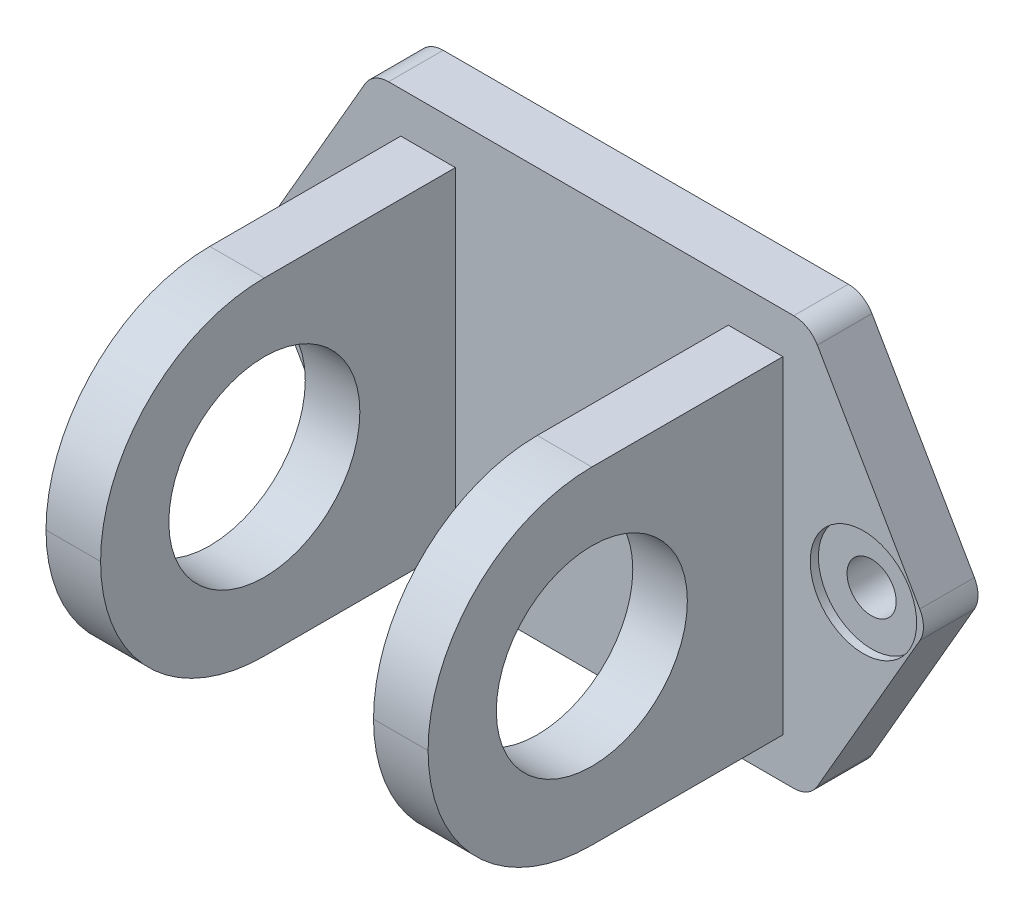
ISO-10303-21;
HEADER;
FILE_DESCRIPTION(('STEP AP214'),'2;1');
FILE_NAME('part.step','',(''),(''),'','','');
FILE_SCHEMA(('AUTOMOTIVE_DESIGN { 1 0 10303 214 1 1 1 1 }'));
ENDSEC;
DATA;
#1=APPLICATION_CONTEXT('core data for automotive mechanical design processes');
#2=APPLICATION_PROTOCOL_DEFINITION('international standard','automotive_design',2000,#1);
#3=PRODUCT_CONTEXT('',#1,'mechanical');
#4=PRODUCT('Part','Part','',(#3));
#5=PRODUCT_RELATED_PRODUCT_CATEGORY('part','',(#4));
#6=PRODUCT_DEFINITION_FORMATION('','',#4);
#7=PRODUCT_DEFINITION_CONTEXT('part definition',#1,'design');
#8=PRODUCT_DEFINITION('design','',#6,#7);
#9=PRODUCT_DEFINITION_SHAPE('','',#8);
#10=(LENGTH_UNIT() NAMED_UNIT(*) SI_UNIT(.MILLI.,.METRE.));
#11=(NAMED_UNIT(*) PLANE_ANGLE_UNIT() SI_UNIT($,.RADIAN.));
#12=(NAMED_UNIT(*) SI_UNIT($,.STERADIAN.) SOLID_ANGLE_UNIT());
#13=UNCERTAINTY_MEASURE_WITH_UNIT(LENGTH_MEASURE(1.E-05),#10,'distance_accuracy_value','');
#14=(GEOMETRIC_REPRESENTATION_CONTEXT(3) GLOBAL_UNCERTAINTY_ASSIGNED_CONTEXT((#13)) GLOBAL_UNIT_ASSIGNED_CONTEXT((#10,
#11,#12)) REPRESENTATION_CONTEXT('',''));
#15=CARTESIAN_POINT('',(0.,0.,0.));
#16=DIRECTION('',(0.,0.,1.));
#17=DIRECTION('',(1.,0.,0.));
#18=AXIS2_PLACEMENT_3D('',#15,#16,#17);
#19=CARTESIAN_POINT('',(-75.0456683677447,-9.16171908362269,0.));
#20=DIRECTION('',(0.,0.,1.));
#21=DIRECTION('',(1.,0.,0.));
#22=AXIS2_PLACEMENT_3D('',#19,#20,#21);
#23=CYLINDRICAL_SURFACE('',#22,9.);
#24=CARTESIAN_POINT('',(-75.0456683677447,-9.16171908362269,0.));
#25=DIRECTION('',(0.,0.,1.));
#26=DIRECTION('',(1.,0.,0.));
#27=AXIS2_PLACEMENT_3D('',#24,#25,#26);
#28=CIRCLE('',#27,9.);
#29=CARTESIAN_POINT('',(-66.0456683677447,-9.16171908362269,0.));
#30=VERTEX_POINT('',#29);
#31=EDGE_CURVE('E362',#30,#30,#28,.T.);
#32=ORIENTED_EDGE('',*,*,#31,.F.);
#33=EDGE_LOOP('',(#32));
#34=FACE_BOUND('',#33,.T.);
#35=CARTESIAN_POINT('',(-75.0456683677447,-9.16171908362269,17.));
#36=DIRECTION('',(0.,0.,1.));
#37=DIRECTION('',(1.,0.,0.));
#38=AXIS2_PLACEMENT_3D('',#35,#36,#37);
#39=CIRCLE('',#38,9.);
#40=CARTESIAN_POINT('',(-66.0456683677447,-9.16171908362269,17.));
#41=VERTEX_POINT('',#40);
#42=EDGE_CURVE('E42',#41,#41,#39,.F.);
#43=ORIENTED_EDGE('',*,*,#42,.F.);
#44=EDGE_LOOP('',(#43));
#45=FACE_BOUND('',#44,.T.);
#46=ADVANCED_FACE('F38',(#34,#45),#23,.F.);
#47=CARTESIAN_POINT('',(-274.554197978604,-9.16171905813241,0.));
#48=DIRECTION('',(0.,0.,1.));
#49=DIRECTION('',(1.,0.,0.));
#50=AXIS2_PLACEMENT_3D('',#47,#48,#49);
#51=CYLINDRICAL_SURFACE('',#50,8.99999999999998);
#52=CARTESIAN_POINT('',(-274.554197978604,-9.16171905813241,0.));
#53=DIRECTION('',(0.,0.,1.));
#54=DIRECTION('',(1.,0.,0.));
#55=AXIS2_PLACEMENT_3D('',#52,#53,#54);
#56=CIRCLE('',#55,8.99999999999998);
#57=CARTESIAN_POINT('',(-265.554197978604,-9.16171905813241,0.));
#58=VERTEX_POINT('',#57);
#59=EDGE_CURVE('E377',#58,#58,#56,.T.);
#60=ORIENTED_EDGE('',*,*,#59,.F.);
#61=EDGE_LOOP('',(#60));
#62=FACE_BOUND('',#61,.T.);
#63=CARTESIAN_POINT('',(-274.554197978604,-9.16171905813241,17.));
#64=DIRECTION('',(0.,0.,1.));
#65=DIRECTION('',(1.,0.,0.));
#66=AXIS2_PLACEMENT_3D('',#63,#64,#65);
#67=CIRCLE('',#66,8.99999999999998);
#68=CARTESIAN_POINT('',(-265.554197978604,-9.16171905813241,17.));
#69=VERTEX_POINT('',#68);
#70=EDGE_CURVE('E356',#69,#69,#67,.F.);
#71=ORIENTED_EDGE('',*,*,#70,.F.);
#72=EDGE_LOOP('',(#71));
#73=FACE_BOUND('',#72,.T.);
#74=ADVANCED_FACE('F417',(#62,#73),#51,.F.);
#75=CARTESIAN_POINT('',(0.,0.,20.));
#76=DIRECTION('',(0.,0.,-1.));
#77=DIRECTION('',(-1.,0.,0.));
#78=AXIS2_PLACEMENT_3D('',#75,#76,#77);
#79=PLANE('',#78);
#80=CARTESIAN_POINT('',(-274.554197978604,-9.16171905813241,20.));
#81=DIRECTION('',(0.,0.,1.));
#82=DIRECTION('',(1.,0.,0.));
#83=AXIS2_PLACEMENT_3D('',#80,#81,#82);
#84=CIRCLE('',#83,19.3755110080059);
#85=CARTESIAN_POINT('',(-255.178686970598,-9.16171905813241,20.));
#86=VERTEX_POINT('',#85);
#87=EDGE_CURVE('E364',#86,#86,#84,.T.);
#88=ORIENTED_EDGE('',*,*,#87,.F.);
#89=EDGE_LOOP('',(#88));
#90=FACE_BOUND('',#89,.T.);
#91=CARTESIAN_POINT('',(-75.0456683677447,-9.16171908362269,20.));
#92=DIRECTION('',(0.,0.,1.));
#93=DIRECTION('',(1.,0.,0.));
#94=AXIS2_PLACEMENT_3D('',#91,#92,#93);
#95=CIRCLE('',#94,19.5008846682352);
#96=CARTESIAN_POINT('',(-55.5447836995095,-9.16171908362269,20.));
#97=VERTEX_POINT('',#96);
#98=EDGE_CURVE('E374',#97,#97,#95,.T.);
#99=ORIENTED_EDGE('',*,*,#98,.F.);
#100=EDGE_LOOP('',(#99));
#101=FACE_BOUND('',#100,.T.);
#102=DIRECTION('',(0.,-1.,0.));
#103=VECTOR('',#102,1.);
#104=CARTESIAN_POINT('',(-244.554197978604,50.8382809418676,20.));
#105=LINE('',#104,#103);
#106=CARTESIAN_POINT('',(-244.554197978604,50.8382809418676,20.));
#107=VERTEX_POINT('',#106);
#108=CARTESIAN_POINT('',(-244.554197978604,-69.1617190581324,20.));
#109=VERTEX_POINT('',#108);
#110=EDGE_CURVE('E222',#107,#109,#105,.T.);
#111=ORIENTED_EDGE('',*,*,#110,.F.);
#112=DIRECTION('',(-1.,0.,0.));
#113=VECTOR('',#112,1.);
#114=CARTESIAN_POINT('',(-244.554197978604,50.8382809418676,20.));
#115=LINE('',#114,#113);
#116=CARTESIAN_POINT('',(-224.554197978604,50.8382809418676,20.));
#117=VERTEX_POINT('',#116);
#118=EDGE_CURVE('E231',#117,#107,#115,.T.);
#119=ORIENTED_EDGE('',*,*,#118,.F.);
#120=DIRECTION('',(0.,1.,0.));
#121=VECTOR('',#120,1.);
#122=CARTESIAN_POINT('',(-224.554197978604,50.8382809418676,20.));
#123=LINE('',#122,#121);
#124=CARTESIAN_POINT('',(-224.554197978604,-69.1617190581324,20.));
#125=VERTEX_POINT('',#124);
#126=EDGE_CURVE('E228',#125,#117,#123,.T.);
#127=ORIENTED_EDGE('',*,*,#126,.F.);
#128=DIRECTION('',(1.,0.,0.));
#129=VECTOR('',#128,1.);
#130=CARTESIAN_POINT('',(-244.554197978604,-69.1617190581324,20.));
#131=LINE('',#130,#129);
#132=EDGE_CURVE('E225',#109,#125,#131,.T.);
#133=ORIENTED_EDGE('',*,*,#132,.F.);
#134=EDGE_LOOP('',(#111,#119,#127,#133));
#135=FACE_BOUND('',#134,.T.);
#136=DIRECTION('',(0.499999989191975,0.866025410024455,0.));
#137=VECTOR('',#136,1.);
#138=CARTESIAN_POINT('',(-51.4986629839522,-9.16171905813241,20.));
#139=LINE('',#138,#137);
#140=CARTESIAN_POINT('',(-91.9131806000229,-79.1617189500522,20.));
#141=VERTEX_POINT('',#140);
#142=CARTESIAN_POINT('',(-54.3854142675002,-14.1617190941592,20.));
#143=VERTEX_POINT('',#142);
#144=EDGE_CURVE('E256',#141,#143,#139,.T.);
#145=ORIENTED_EDGE('',*,*,#144,.T.);
#146=CARTESIAN_POINT('',(-63.0456683677447,-9.16171920223945,20.));
#147=DIRECTION('',(0.,0.,-1.));
#148=DIRECTION('',(-1.,0.,0.));
#149=AXIS2_PLACEMENT_3D('',#146,#147,#148);
#150=CIRCLE('',#149,10.);
#151=CARTESIAN_POINT('',(-54.3854143923005,-4.16171909415917,20.));
#152=VERTEX_POINT('',#151);
#153=EDGE_CURVE('E330',#143,#152,#150,.F.);
#154=ORIENTED_EDGE('',*,*,#153,.T.);
#155=DIRECTION('',(-0.500000010808027,0.866025397544421,0.));
#156=VECTOR('',#155,1.);
#157=CARTESIAN_POINT('',(-94.7999344211776,65.8382809418676,20.));
#158=LINE('',#157,#156);
#159=CARTESIAN_POINT('',(-91.9131830544294,60.8382810499479,20.));
#160=VERTEX_POINT('',#159);
#161=EDGE_CURVE('E259',#152,#160,#158,.T.);
#162=ORIENTED_EDGE('',*,*,#161,.T.);
#163=CARTESIAN_POINT('',(-100.573437029874,55.8382809418676,20.));
#164=DIRECTION('',(0.,0.,-1.));
#165=DIRECTION('',(-1.,0.,0.));
#166=AXIS2_PLACEMENT_3D('',#163,#164,#165);
#167=CIRCLE('',#166,10.);
#168=CARTESIAN_POINT('',(-100.573437029874,65.8382809418676,20.));
#169=VERTEX_POINT('',#168);
#170=EDGE_CURVE('E285',#160,#169,#167,.F.);
#171=ORIENTED_EDGE('',*,*,#170,.T.);
#172=DIRECTION('',(-1.,0.,0.));
#173=VECTOR('',#172,1.);
#174=CARTESIAN_POINT('',(-254.799934421178,65.8382809418676,20.));
#175=LINE('',#174,#173);
#176=CARTESIAN_POINT('',(-249.026431646081,65.8382809418676,20.));
#177=VERTEX_POINT('',#176);
#178=EDGE_CURVE('E243',#169,#177,#175,.T.);
#179=ORIENTED_EDGE('',*,*,#178,.T.);
#180=CARTESIAN_POINT('',(-249.026431646081,55.8382809418676,20.));
#181=DIRECTION('',(0.,0.,-1.));
#182=DIRECTION('',(-1.,0.,0.));
#183=AXIS2_PLACEMENT_3D('',#180,#181,#182);
#184=CIRCLE('',#183,10.);
#185=CARTESIAN_POINT('',(-257.686685746326,60.8382808337873,20.));
#186=VERTEX_POINT('',#185);
#187=EDGE_CURVE('E294',#177,#186,#184,.F.);
#188=ORIENTED_EDGE('',*,*,#187,.T.);
#189=DIRECTION('',(-0.499999989191975,-0.866025410024455,0.));
#190=VECTOR('',#189,1.);
#191=CARTESIAN_POINT('',(-254.799934421178,65.8382809418676,20.));
#192=LINE('',#191,#190);
#193=CARTESIAN_POINT('',(-295.214452078848,-4.16171902210563,20.));
#194=VERTEX_POINT('',#193);
#195=EDGE_CURVE('E246',#186,#194,#192,.T.);
#196=ORIENTED_EDGE('',*,*,#195,.T.);
#197=CARTESIAN_POINT('',(-286.554197978604,-9.16171891402537,20.));
#198=DIRECTION('',(0.,0.,-1.));
#199=DIRECTION('',(-1.,0.,0.));
#200=AXIS2_PLACEMENT_3D('',#197,#198,#199);
#201=CIRCLE('',#200,10.);
#202=CARTESIAN_POINT('',(-295.214451954048,-14.1617190221057,20.));
#203=VERTEX_POINT('',#202);
#204=EDGE_CURVE('E303',#194,#203,#201,.F.);
#205=ORIENTED_EDGE('',*,*,#204,.T.);
#206=DIRECTION('',(0.500000010808027,-0.866025397544421,0.));
#207=VECTOR('',#206,1.);
#208=CARTESIAN_POINT('',(-298.101203362396,-9.16171905813241,20.));
#209=LINE('',#208,#207);
#210=CARTESIAN_POINT('',(-257.686683291919,-79.1617191662127,20.));
#211=VERTEX_POINT('',#210);
#212=EDGE_CURVE('E250',#203,#211,#209,.T.);
#213=ORIENTED_EDGE('',*,*,#212,.T.);
#214=CARTESIAN_POINT('',(-249.026429316475,-74.1617190581324,20.));
#215=DIRECTION('',(0.,0.,-1.));
#216=DIRECTION('',(-1.,0.,0.));
#217=AXIS2_PLACEMENT_3D('',#214,#215,#216);
#218=CIRCLE('',#217,10.);
#219=CARTESIAN_POINT('',(-249.026429316475,-84.1617190581324,20.));
#220=VERTEX_POINT('',#219);
#221=EDGE_CURVE('E312',#211,#220,#218,.F.);
#222=ORIENTED_EDGE('',*,*,#221,.T.);
#223=DIRECTION('',(1.,0.,0.));
#224=VECTOR('',#223,1.);
#225=CARTESIAN_POINT('',(-254.799931925171,-84.1617190581324,20.));
#226=LINE('',#225,#224);
#227=CARTESIAN_POINT('',(-100.573434700267,-84.1617190581324,20.));
#228=VERTEX_POINT('',#227);
#229=EDGE_CURVE('E253',#220,#228,#226,.T.);
#230=ORIENTED_EDGE('',*,*,#229,.T.);
#231=CARTESIAN_POINT('',(-100.573434700267,-74.1617190581324,20.));
#232=DIRECTION('',(0.,0.,-1.));
#233=DIRECTION('',(-1.,0.,0.));
#234=AXIS2_PLACEMENT_3D('',#231,#232,#233);
#235=CIRCLE('',#234,10.);
#236=EDGE_CURVE('E321',#228,#141,#235,.F.);
#237=ORIENTED_EDGE('',*,*,#236,.T.);
#238=EDGE_LOOP('',(#145,#154,#162,#171,#179,#188,#196,#205,#213,#222,#230,#237));
#239=FACE_BOUND('',#238,.T.);
#240=DIRECTION('',(0.,-1.,0.));
#241=VECTOR('',#240,1.);
#242=CARTESIAN_POINT('',(-124.554197978604,50.8382809418676,20.));
#243=LINE('',#242,#241);
#244=CARTESIAN_POINT('',(-124.554197978604,50.8382809418676,20.));
#245=VERTEX_POINT('',#244);
#246=CARTESIAN_POINT('',(-124.554197978604,-69.1617190581324,20.));
#247=VERTEX_POINT('',#246);
#248=EDGE_CURVE('E192',#245,#247,#243,.T.);
#249=ORIENTED_EDGE('',*,*,#248,.F.);
#250=DIRECTION('',(-1.,0.,0.));
#251=VECTOR('',#250,1.);
#252=CARTESIAN_POINT('',(-124.554197978604,50.8382809418676,20.));
#253=LINE('',#252,#251);
#254=CARTESIAN_POINT('',(-104.554197978604,50.8382809418676,20.));
#255=VERTEX_POINT('',#254);
#256=EDGE_CURVE('E198',#255,#245,#253,.T.);
#257=ORIENTED_EDGE('',*,*,#256,.F.);
#258=DIRECTION('',(0.,1.,0.));
#259=VECTOR('',#258,1.);
#260=CARTESIAN_POINT('',(-104.554197978604,50.8382809418676,20.));
#261=LINE('',#260,#259);
#262=CARTESIAN_POINT('',(-104.554197978604,-69.1617190581324,20.));
#263=VERTEX_POINT('',#262);
#264=EDGE_CURVE('E212',#263,#255,#261,.T.);
#265=ORIENTED_EDGE('',*,*,#264,.F.);
#266=DIRECTION('',(1.,0.,0.));
#267=VECTOR('',#266,1.);
#268=CARTESIAN_POINT('',(-124.554197978604,-69.1617190581324,20.));
#269=LINE('',#268,#267);
#270=EDGE_CURVE('E207',#247,#263,#269,.T.);
#271=ORIENTED_EDGE('',*,*,#270,.F.);
#272=EDGE_LOOP('',(#249,#257,#265,#271));
#273=FACE_BOUND('',#272,.T.);
#274=ADVANCED_FACE('F203',(#90,#101,#135,#239,#273),#79,.F.);
#275=CARTESIAN_POINT('',(-254.799934421178,65.8382809418676,20.));
#276=DIRECTION('',(0.,-1.,0.));
#277=DIRECTION('',(0.,0.,-1.));
#278=AXIS2_PLACEMENT_3D('',#275,#276,#277);
#279=PLANE('',#278);
#280=DIRECTION('',(-1.,0.,0.));
#281=VECTOR('',#280,1.);
#282=CARTESIAN_POINT('',(-254.799934421178,65.8382809418676,0.));
#283=LINE('',#282,#281);
#284=CARTESIAN_POINT('',(-100.573437029874,65.8382809418676,0.));
#285=VERTEX_POINT('',#284);
#286=CARTESIAN_POINT('',(-249.026431646081,65.8382809418676,0.));
#287=VERTEX_POINT('',#286);
#288=EDGE_CURVE('E242',#285,#287,#283,.T.);
#289=ORIENTED_EDGE('',*,*,#288,.T.);
#290=DIRECTION('',(0.,0.,-1.));
#291=VECTOR('',#290,1.);
#292=CARTESIAN_POINT('',(-249.026431646081,65.8382809418676,20.));
#293=LINE('',#292,#291);
#294=EDGE_CURVE('E292',#287,#177,#293,.F.);
#295=ORIENTED_EDGE('',*,*,#294,.T.);
#296=ORIENTED_EDGE('',*,*,#178,.F.);
#297=DIRECTION('',(0.,0.,-1.));
#298=VECTOR('',#297,1.);
#299=CARTESIAN_POINT('',(-100.573437029874,65.8382809418676,20.));
#300=LINE('',#299,#298);
#301=EDGE_CURVE('E261',#169,#285,#300,.T.);
#302=ORIENTED_EDGE('',*,*,#301,.T.);
#303=EDGE_LOOP('',(#289,#295,#296,#302));
#304=FACE_BOUND('',#303,.T.);
#305=ADVANCED_FACE('F481',(#304),#279,.F.);
#306=CARTESIAN_POINT('',(-254.799934421178,65.8382809418676,20.));
#307=DIRECTION('',(0.866025410024455,-0.499999989191975,0.));
#308=DIRECTION('',(0.499999989191975,0.866025410024455,0.));
#309=AXIS2_PLACEMENT_3D('',#306,#307,#308);
#310=PLANE('',#309);
#311=DIRECTION('',(-0.499999989191975,-0.866025410024455,0.));
#312=VECTOR('',#311,1.);
#313=CARTESIAN_POINT('',(-254.799934421178,65.8382809418676,0.));
#314=LINE('',#313,#312);
#315=CARTESIAN_POINT('',(-257.686685746326,60.8382808337873,0.));
#316=VERTEX_POINT('',#315);
#317=CARTESIAN_POINT('',(-295.214452078848,-4.16171902210563,0.));
#318=VERTEX_POINT('',#317);
#319=EDGE_CURVE('E264',#316,#318,#314,.T.);
#320=ORIENTED_EDGE('',*,*,#319,.T.);
#321=DIRECTION('',(0.,0.,-1.));
#322=VECTOR('',#321,1.);
#323=CARTESIAN_POINT('',(-295.214452078848,-4.16171902210563,20.));
#324=LINE('',#323,#322);
#325=EDGE_CURVE('E301',#318,#194,#324,.F.);
#326=ORIENTED_EDGE('',*,*,#325,.T.);
#327=ORIENTED_EDGE('',*,*,#195,.F.);
#328=DIRECTION('',(0.,0.,-1.));
#329=VECTOR('',#328,1.);
#330=CARTESIAN_POINT('',(-257.686685746326,60.8382808337873,20.));
#331=LINE('',#330,#329);
#332=EDGE_CURVE('E287',#186,#316,#331,.T.);
#333=ORIENTED_EDGE('',*,*,#332,.T.);
#334=EDGE_LOOP('',(#320,#326,#327,#333));
#335=FACE_BOUND('',#334,.T.);
#336=ADVANCED_FACE('F503',(#335),#310,.F.);
#337=CARTESIAN_POINT('',(-298.101203362396,-9.16171905813241,20.));
#338=DIRECTION('',(0.866025397544421,0.500000010808027,0.));
#339=DIRECTION('',(-0.500000010808027,0.866025397544421,0.));
#340=AXIS2_PLACEMENT_3D('',#337,#338,#339);
#341=PLANE('',#340);
#342=DIRECTION('',(0.500000010808027,-0.866025397544421,0.));
#343=VECTOR('',#342,1.);
#344=CARTESIAN_POINT('',(-298.101203362396,-9.16171905813241,0.));
#345=LINE('',#344,#343);
#346=CARTESIAN_POINT('',(-295.214451954048,-14.1617190221057,0.));
#347=VERTEX_POINT('',#346);
#348=CARTESIAN_POINT('',(-257.686683291919,-79.1617191662127,0.));
#349=VERTEX_POINT('',#348);
#350=EDGE_CURVE('E267',#347,#349,#345,.T.);
#351=ORIENTED_EDGE('',*,*,#350,.T.);
#352=DIRECTION('',(0.,0.,-1.));
#353=VECTOR('',#352,1.);
#354=CARTESIAN_POINT('',(-257.686683291919,-79.1617191662127,20.));
#355=LINE('',#354,#353);
#356=EDGE_CURVE('E310',#349,#211,#355,.F.);
#357=ORIENTED_EDGE('',*,*,#356,.T.);
#358=ORIENTED_EDGE('',*,*,#212,.F.);
#359=DIRECTION('',(0.,0.,-1.));
#360=VECTOR('',#359,1.);
#361=CARTESIAN_POINT('',(-295.214451954048,-14.1617190221057,20.));
#362=LINE('',#361,#360);
#363=EDGE_CURVE('E296',#203,#347,#362,.T.);
#364=ORIENTED_EDGE('',*,*,#363,.T.);
#365=EDGE_LOOP('',(#351,#357,#358,#364));
#366=FACE_BOUND('',#365,.T.);
#367=ADVANCED_FACE('F499',(#366),#341,.F.);
#368=CARTESIAN_POINT('',(-254.799931925171,-84.1617190581324,20.));
#369=DIRECTION('',(0.,1.,0.));
#370=DIRECTION('',(0.,0.,1.));
#371=AXIS2_PLACEMENT_3D('',#368,#369,#370);
#372=PLANE('',#371);
#373=DIRECTION('',(1.,0.,0.));
#374=VECTOR('',#373,1.);
#375=CARTESIAN_POINT('',(-254.799931925171,-84.1617190581324,0.));
#376=LINE('',#375,#374);
#377=CARTESIAN_POINT('',(-249.026429316475,-84.1617190581324,0.));
#378=VERTEX_POINT('',#377);
#379=CARTESIAN_POINT('',(-100.573434700267,-84.1617190581324,0.));
#380=VERTEX_POINT('',#379);
#381=EDGE_CURVE('E270',#378,#380,#376,.T.);
#382=ORIENTED_EDGE('',*,*,#381,.T.);
#383=DIRECTION('',(0.,0.,-1.));
#384=VECTOR('',#383,1.);
#385=CARTESIAN_POINT('',(-100.573434700267,-84.1617190581324,20.));
#386=LINE('',#385,#384);
#387=EDGE_CURVE('E319',#380,#228,#386,.F.);
#388=ORIENTED_EDGE('',*,*,#387,.T.);
#389=ORIENTED_EDGE('',*,*,#229,.F.);
#390=DIRECTION('',(0.,0.,-1.));
#391=VECTOR('',#390,1.);
#392=CARTESIAN_POINT('',(-249.026429316475,-84.1617190581324,20.));
#393=LINE('',#392,#391);
#394=EDGE_CURVE('E305',#220,#378,#393,.T.);
#395=ORIENTED_EDGE('',*,*,#394,.T.);
#396=EDGE_LOOP('',(#382,#388,#389,#395));
#397=FACE_BOUND('',#396,.T.);
#398=ADVANCED_FACE('F495',(#397),#372,.F.);
#399=CARTESIAN_POINT('',(-51.4986629839522,-9.16171905813241,20.));
#400=DIRECTION('',(-0.866025410024455,0.499999989191975,0.));
#401=DIRECTION('',(-0.499999989191975,-0.866025410024455,0.));
#402=AXIS2_PLACEMENT_3D('',#399,#400,#401);
#403=PLANE('',#402);
#404=DIRECTION('',(0.499999989191975,0.866025410024455,0.));
#405=VECTOR('',#404,1.);
#406=CARTESIAN_POINT('',(-51.4986629839522,-9.16171905813241,0.));
#407=LINE('',#406,#405);
#408=CARTESIAN_POINT('',(-91.9131806000229,-79.1617189500522,0.));
#409=VERTEX_POINT('',#408);
#410=CARTESIAN_POINT('',(-54.3854142675002,-14.1617190941592,0.));
#411=VERTEX_POINT('',#410);
#412=EDGE_CURVE('E273',#409,#411,#407,.T.);
#413=ORIENTED_EDGE('',*,*,#412,.T.);
#414=DIRECTION('',(0.,0.,-1.));
#415=VECTOR('',#414,1.);
#416=CARTESIAN_POINT('',(-54.3854142675002,-14.1617190941592,20.));
#417=LINE('',#416,#415);
#418=EDGE_CURVE('E328',#411,#143,#417,.F.);
#419=ORIENTED_EDGE('',*,*,#418,.T.);
#420=ORIENTED_EDGE('',*,*,#144,.F.);
#421=DIRECTION('',(0.,0.,-1.));
#422=VECTOR('',#421,1.);
#423=CARTESIAN_POINT('',(-91.9131806000229,-79.1617189500522,20.));
#424=LINE('',#423,#422);
#425=EDGE_CURVE('E314',#141,#409,#424,.T.);
#426=ORIENTED_EDGE('',*,*,#425,.T.);
#427=EDGE_LOOP('',(#413,#419,#420,#426));
#428=FACE_BOUND('',#427,.T.);
#429=ADVANCED_FACE('F491',(#428),#403,.F.);
#430=CARTESIAN_POINT('',(-94.7999344211776,65.8382809418676,20.));
#431=DIRECTION('',(-0.866025397544421,-0.500000010808027,0.));
#432=DIRECTION('',(0.500000010808027,-0.866025397544421,0.));
#433=AXIS2_PLACEMENT_3D('',#430,#431,#432);
#434=PLANE('',#433);
#435=ORIENTED_EDGE('',*,*,#161,.F.);
#436=DIRECTION('',(0.,0.,-1.));
#437=VECTOR('',#436,1.);
#438=CARTESIAN_POINT('',(-54.3854143923005,-4.16171909415917,20.));
#439=LINE('',#438,#437);
#440=CARTESIAN_POINT('',(-54.3854143923005,-4.16171909415917,0.));
#441=VERTEX_POINT('',#440);
#442=EDGE_CURVE('E323',#152,#441,#439,.T.);
#443=ORIENTED_EDGE('',*,*,#442,.T.);
#444=DIRECTION('',(-0.500000010808027,0.866025397544421,0.));
#445=VECTOR('',#444,1.);
#446=CARTESIAN_POINT('',(-94.7999344211776,65.8382809418676,0.));
#447=LINE('',#446,#445);
#448=CARTESIAN_POINT('',(-91.9131830544294,60.8382810499479,0.));
#449=VERTEX_POINT('',#448);
#450=EDGE_CURVE('E247',#441,#449,#447,.T.);
#451=ORIENTED_EDGE('',*,*,#450,.T.);
#452=DIRECTION('',(0.,0.,-1.));
#453=VECTOR('',#452,1.);
#454=CARTESIAN_POINT('',(-91.9131830544294,60.8382810499479,20.));
#455=LINE('',#454,#453);
#456=EDGE_CURVE('E282',#449,#160,#455,.F.);
#457=ORIENTED_EDGE('',*,*,#456,.T.);
#458=EDGE_LOOP('',(#435,#443,#451,#457));
#459=FACE_BOUND('',#458,.T.);
#460=ADVANCED_FACE('F487',(#459),#434,.F.);
#461=CARTESIAN_POINT('',(0.,0.,0.));
#462=DIRECTION('',(0.,0.,-1.));
#463=DIRECTION('',(-1.,0.,0.));
#464=AXIS2_PLACEMENT_3D('',#461,#462,#463);
#465=PLANE('',#464);
#466=ORIENTED_EDGE('',*,*,#59,.T.);
#467=EDGE_LOOP('',(#466));
#468=FACE_BOUND('',#467,.T.);
#469=ORIENTED_EDGE('',*,*,#31,.T.);
#470=EDGE_LOOP('',(#469));
#471=FACE_BOUND('',#470,.T.);
#472=ORIENTED_EDGE('',*,*,#450,.F.);
#473=CARTESIAN_POINT('',(-63.0456683677447,-9.16171920223945,0.));
#474=DIRECTION('',(0.,0.,-1.));
#475=DIRECTION('',(-1.,0.,0.));
#476=AXIS2_PLACEMENT_3D('',#473,#474,#475);
#477=CIRCLE('',#476,10.);
#478=EDGE_CURVE('E326',#441,#411,#477,.T.);
#479=ORIENTED_EDGE('',*,*,#478,.T.);
#480=ORIENTED_EDGE('',*,*,#412,.F.);
#481=CARTESIAN_POINT('',(-100.573434700267,-74.1617190581324,0.));
#482=DIRECTION('',(0.,0.,-1.));
#483=DIRECTION('',(-1.,0.,0.));
#484=AXIS2_PLACEMENT_3D('',#481,#482,#483);
#485=CIRCLE('',#484,10.);
#486=EDGE_CURVE('E317',#409,#380,#485,.T.);
#487=ORIENTED_EDGE('',*,*,#486,.T.);
#488=ORIENTED_EDGE('',*,*,#381,.F.);
#489=CARTESIAN_POINT('',(-249.026429316475,-74.1617190581324,0.));
#490=DIRECTION('',(0.,0.,-1.));
#491=DIRECTION('',(-1.,0.,0.));
#492=AXIS2_PLACEMENT_3D('',#489,#490,#491);
#493=CIRCLE('',#492,10.);
#494=EDGE_CURVE('E308',#378,#349,#493,.T.);
#495=ORIENTED_EDGE('',*,*,#494,.T.);
#496=ORIENTED_EDGE('',*,*,#350,.F.);
#497=CARTESIAN_POINT('',(-286.554197978604,-9.16171891402537,0.));
#498=DIRECTION('',(0.,0.,-1.));
#499=DIRECTION('',(-1.,0.,0.));
#500=AXIS2_PLACEMENT_3D('',#497,#498,#499);
#501=CIRCLE('',#500,10.);
#502=EDGE_CURVE('E299',#347,#318,#501,.T.);
#503=ORIENTED_EDGE('',*,*,#502,.T.);
#504=ORIENTED_EDGE('',*,*,#319,.F.);
#505=CARTESIAN_POINT('',(-249.026431646081,55.8382809418676,0.));
#506=DIRECTION('',(0.,0.,-1.));
#507=DIRECTION('',(-1.,0.,0.));
#508=AXIS2_PLACEMENT_3D('',#505,#506,#507);
#509=CIRCLE('',#508,10.);
#510=EDGE_CURVE('E290',#316,#287,#509,.T.);
#511=ORIENTED_EDGE('',*,*,#510,.T.);
#512=ORIENTED_EDGE('',*,*,#288,.F.);
#513=CARTESIAN_POINT('',(-100.573437029874,55.8382809418676,0.));
#514=DIRECTION('',(0.,0.,-1.));
#515=DIRECTION('',(-1.,0.,0.));
#516=AXIS2_PLACEMENT_3D('',#513,#514,#515);
#517=CIRCLE('',#516,10.);
#518=EDGE_CURVE('E279',#285,#449,#517,.T.);
#519=ORIENTED_EDGE('',*,*,#518,.T.);
#520=EDGE_LOOP('',(#472,#479,#480,#487,#488,#495,#496,#503,#504,#511,#512,#519));
#521=FACE_BOUND('',#520,.T.);
#522=ADVANCED_FACE('F483',(#468,#471,#521),#465,.T.);
#523=CARTESIAN_POINT('',(-100.573437029874,55.8382809418676,20.));
#524=DIRECTION('',(0.,0.,-1.));
#525=DIRECTION('',(-1.,0.,0.));
#526=AXIS2_PLACEMENT_3D('',#523,#524,#525);
#527=CYLINDRICAL_SURFACE('',#526,10.);
#528=ORIENTED_EDGE('',*,*,#170,.F.);
#529=ORIENTED_EDGE('',*,*,#456,.F.);
#530=ORIENTED_EDGE('',*,*,#518,.F.);
#531=ORIENTED_EDGE('',*,*,#301,.F.);
#532=EDGE_LOOP('',(#528,#529,#530,#531));
#533=FACE_BOUND('',#532,.T.);
#534=ADVANCED_FACE('F486',(#533),#527,.T.);
#535=CARTESIAN_POINT('',(-249.026431646081,55.8382809418676,20.));
#536=DIRECTION('',(0.,0.,-1.));
#537=DIRECTION('',(-1.,0.,0.));
#538=AXIS2_PLACEMENT_3D('',#535,#536,#537);
#539=CYLINDRICAL_SURFACE('',#538,10.);
#540=ORIENTED_EDGE('',*,*,#187,.F.);
#541=ORIENTED_EDGE('',*,*,#294,.F.);
#542=ORIENTED_EDGE('',*,*,#510,.F.);
#543=ORIENTED_EDGE('',*,*,#332,.F.);
#544=EDGE_LOOP('',(#540,#541,#542,#543));
#545=FACE_BOUND('',#544,.T.);
#546=ADVANCED_FACE('F513',(#545),#539,.T.);
#547=CARTESIAN_POINT('',(-286.554197978604,-9.16171891402537,20.));
#548=DIRECTION('',(0.,0.,-1.));
#549=DIRECTION('',(-1.,0.,0.));
#550=AXIS2_PLACEMENT_3D('',#547,#548,#549);
#551=CYLINDRICAL_SURFACE('',#550,10.);
#552=ORIENTED_EDGE('',*,*,#204,.F.);
#553=ORIENTED_EDGE('',*,*,#325,.F.);
#554=ORIENTED_EDGE('',*,*,#502,.F.);
#555=ORIENTED_EDGE('',*,*,#363,.F.);
#556=EDGE_LOOP('',(#552,#553,#554,#555));
#557=FACE_BOUND('',#556,.T.);
#558=ADVANCED_FACE('F517',(#557),#551,.T.);
#559=CARTESIAN_POINT('',(-249.026429316475,-74.1617190581324,20.));
#560=DIRECTION('',(0.,0.,-1.));
#561=DIRECTION('',(-1.,0.,0.));
#562=AXIS2_PLACEMENT_3D('',#559,#560,#561);
#563=CYLINDRICAL_SURFACE('',#562,10.);
#564=ORIENTED_EDGE('',*,*,#221,.F.);
#565=ORIENTED_EDGE('',*,*,#356,.F.);
#566=ORIENTED_EDGE('',*,*,#494,.F.);
#567=ORIENTED_EDGE('',*,*,#394,.F.);
#568=EDGE_LOOP('',(#564,#565,#566,#567));
#569=FACE_BOUND('',#568,.T.);
#570=ADVANCED_FACE('F521',(#569),#563,.T.);
#571=CARTESIAN_POINT('',(-100.573434700267,-74.1617190581324,20.));
#572=DIRECTION('',(0.,0.,-1.));
#573=DIRECTION('',(-1.,0.,0.));
#574=AXIS2_PLACEMENT_3D('',#571,#572,#573);
#575=CYLINDRICAL_SURFACE('',#574,10.);
#576=ORIENTED_EDGE('',*,*,#236,.F.);
#577=ORIENTED_EDGE('',*,*,#387,.F.);
#578=ORIENTED_EDGE('',*,*,#486,.F.);
#579=ORIENTED_EDGE('',*,*,#425,.F.);
#580=EDGE_LOOP('',(#576,#577,#578,#579));
#581=FACE_BOUND('',#580,.T.);
#582=ADVANCED_FACE('F525',(#581),#575,.T.);
#583=CARTESIAN_POINT('',(-63.0456683677447,-9.16171920223945,20.));
#584=DIRECTION('',(0.,0.,-1.));
#585=DIRECTION('',(-1.,0.,0.));
#586=AXIS2_PLACEMENT_3D('',#583,#584,#585);
#587=CYLINDRICAL_SURFACE('',#586,10.);
#588=ORIENTED_EDGE('',*,*,#153,.F.);
#589=ORIENTED_EDGE('',*,*,#418,.F.);
#590=ORIENTED_EDGE('',*,*,#478,.F.);
#591=ORIENTED_EDGE('',*,*,#442,.F.);
#592=EDGE_LOOP('',(#588,#589,#590,#591));
#593=FACE_BOUND('',#592,.T.);
#594=ADVANCED_FACE('F448',(#593),#587,.T.);
#595=CARTESIAN_POINT('',(-244.554197978604,50.8382809418676,150.));
#596=DIRECTION('',(1.,0.,0.));
#597=DIRECTION('',(0.,1.,0.));
#598=AXIS2_PLACEMENT_3D('',#595,#596,#597);
#599=PLANE('',#598);
#600=CARTESIAN_POINT('',(-244.554197978604,-9.16171905813244,90.));
#601=DIRECTION('',(1.,0.,0.));
#602=DIRECTION('',(0.,1.,0.));
#603=AXIS2_PLACEMENT_3D('',#600,#601,#602);
#604=CIRCLE('',#603,35.);
#605=CARTESIAN_POINT('',(-244.554197978604,25.8382809418676,90.));
#606=VERTEX_POINT('',#605);
#607=EDGE_CURVE('E208',#606,#606,#604,.T.);
#608=ORIENTED_EDGE('',*,*,#607,.T.);
#609=EDGE_LOOP('',(#608));
#610=FACE_BOUND('',#609,.T.);
#611=CARTESIAN_POINT('',(-244.554197978604,-9.16171905813241,90.));
#612=DIRECTION('',(1.,0.,0.));
#613=DIRECTION('',(0.,1.,0.));
#614=AXIS2_PLACEMENT_3D('',#611,#612,#613);
#615=CIRCLE('',#614,60.);
#616=CARTESIAN_POINT('',(-244.554197978604,-69.1617190581324,90.));
#617=VERTEX_POINT('',#616);
#618=CARTESIAN_POINT('',(-244.554197978604,-9.16171905813241,150.));
#619=VERTEX_POINT('',#618);
#620=EDGE_CURVE('E353',#617,#619,#615,.F.);
#621=ORIENTED_EDGE('',*,*,#620,.T.);
#622=CARTESIAN_POINT('',(-244.554197978604,-9.16171905813241,90.));
#623=DIRECTION('',(1.,0.,0.));
#624=DIRECTION('',(0.,1.,0.));
#625=AXIS2_PLACEMENT_3D('',#622,#623,#624);
#626=CIRCLE('',#625,60.);
#627=CARTESIAN_POINT('',(-244.554197978604,50.8382809418676,90.));
#628=VERTEX_POINT('',#627);
#629=EDGE_CURVE('E62',#619,#628,#626,.F.);
#630=ORIENTED_EDGE('',*,*,#629,.T.);
#631=DIRECTION('',(0.,0.,-1.));
#632=VECTOR('',#631,1.);
#633=CARTESIAN_POINT('',(-244.554197978604,50.8382809418676,150.));
#634=LINE('',#633,#632);
#635=EDGE_CURVE('E234',#628,#107,#634,.T.);
#636=ORIENTED_EDGE('',*,*,#635,.T.);
#637=ORIENTED_EDGE('',*,*,#110,.T.);
#638=DIRECTION('',(0.,0.,-1.));
#639=VECTOR('',#638,1.);
#640=CARTESIAN_POINT('',(-244.554197978604,-69.1617190581324,150.));
#641=LINE('',#640,#639);
#642=EDGE_CURVE('E240',#617,#109,#641,.T.);
#643=ORIENTED_EDGE('',*,*,#642,.F.);
#644=EDGE_LOOP('',(#621,#630,#636,#637,#643));
#645=FACE_BOUND('',#644,.T.);
#646=ADVANCED_FACE('F445',(#610,#645),#599,.F.);
#647=CARTESIAN_POINT('',(-244.554197978604,-69.1617190581324,150.));
#648=DIRECTION('',(0.,1.,0.));
#649=DIRECTION('',(0.,0.,1.));
#650=AXIS2_PLACEMENT_3D('',#647,#648,#649);
#651=PLANE('',#650);
#652=DIRECTION('',(0.,0.,-1.));
#653=VECTOR('',#652,1.);
#654=CARTESIAN_POINT('',(-224.554197978604,-69.1617190581324,150.));
#655=LINE('',#654,#653);
#656=CARTESIAN_POINT('',(-224.554197978604,-69.1617190581324,90.));
#657=VERTEX_POINT('',#656);
#658=EDGE_CURVE('E238',#657,#125,#655,.T.);
#659=ORIENTED_EDGE('',*,*,#658,.F.);
#660=DIRECTION('',(1.,0.,0.));
#661=VECTOR('',#660,1.);
#662=CARTESIAN_POINT('',(-244.554197978604,-69.1617190581324,90.));
#663=LINE('',#662,#661);
#664=EDGE_CURVE('E351',#657,#617,#663,.F.);
#665=ORIENTED_EDGE('',*,*,#664,.T.);
#666=ORIENTED_EDGE('',*,*,#642,.T.);
#667=ORIENTED_EDGE('',*,*,#132,.T.);
#668=EDGE_LOOP('',(#659,#665,#666,#667));
#669=FACE_BOUND('',#668,.T.);
#670=ADVANCED_FACE('F447',(#669),#651,.F.);
#671=CARTESIAN_POINT('',(-224.554197978604,50.8382809418676,150.));
#672=DIRECTION('',(-1.,0.,0.));
#673=DIRECTION('',(0.,-1.,0.));
#674=AXIS2_PLACEMENT_3D('',#671,#672,#673);
#675=PLANE('',#674);
#676=CARTESIAN_POINT('',(-224.554197978604,-9.16171905813243,90.));
#677=DIRECTION('',(-1.,0.,0.));
#678=DIRECTION('',(0.,-1.,0.));
#679=AXIS2_PLACEMENT_3D('',#676,#677,#678);
#680=CIRCLE('',#679,35.);
#681=CARTESIAN_POINT('',(-224.554197978604,-44.1617190581324,90.));
#682=VERTEX_POINT('',#681);
#683=EDGE_CURVE('E388',#682,#682,#680,.T.);
#684=ORIENTED_EDGE('',*,*,#683,.T.);
#685=EDGE_LOOP('',(#684));
#686=FACE_BOUND('',#685,.T.);
#687=DIRECTION('',(0.,0.,-1.));
#688=VECTOR('',#687,1.);
#689=CARTESIAN_POINT('',(-224.554197978604,50.8382809418676,150.));
#690=LINE('',#689,#688);
#691=CARTESIAN_POINT('',(-224.554197978604,50.8382809418676,90.));
#692=VERTEX_POINT('',#691);
#693=EDGE_CURVE('E236',#692,#117,#690,.T.);
#694=ORIENTED_EDGE('',*,*,#693,.F.);
#695=CARTESIAN_POINT('',(-224.554197978604,-9.16171905813241,90.));
#696=DIRECTION('',(-1.,0.,0.));
#697=DIRECTION('',(0.,-1.,0.));
#698=AXIS2_PLACEMENT_3D('',#695,#696,#697);
#699=CIRCLE('',#698,60.);
#700=CARTESIAN_POINT('',(-224.554197978604,-9.16171905813241,150.));
#701=VERTEX_POINT('',#700);
#702=EDGE_CURVE('E11',#692,#701,#699,.F.);
#703=ORIENTED_EDGE('',*,*,#702,.T.);
#704=CARTESIAN_POINT('',(-224.554197978604,-9.16171905813241,90.));
#705=DIRECTION('',(-1.,0.,0.));
#706=DIRECTION('',(0.,-1.,0.));
#707=AXIS2_PLACEMENT_3D('',#704,#705,#706);
#708=CIRCLE('',#707,60.);
#709=EDGE_CURVE('E349',#701,#657,#708,.F.);
#710=ORIENTED_EDGE('',*,*,#709,.T.);
#711=ORIENTED_EDGE('',*,*,#658,.T.);
#712=ORIENTED_EDGE('',*,*,#126,.T.);
#713=EDGE_LOOP('',(#694,#703,#710,#711,#712));
#714=FACE_BOUND('',#713,.T.);
#715=ADVANCED_FACE('F460',(#686,#714),#675,.F.);
#716=CARTESIAN_POINT('',(-244.554197978604,50.8382809418676,150.));
#717=DIRECTION('',(0.,-1.,0.));
#718=DIRECTION('',(0.,0.,-1.));
#719=AXIS2_PLACEMENT_3D('',#716,#717,#718);
#720=PLANE('',#719);
#721=ORIENTED_EDGE('',*,*,#635,.F.);
#722=DIRECTION('',(-1.,0.,0.));
#723=VECTOR('',#722,1.);
#724=CARTESIAN_POINT('',(-224.554197978604,50.8382809418676,90.));
#725=LINE('',#724,#723);
#726=EDGE_CURVE('E47',#628,#692,#725,.F.);
#727=ORIENTED_EDGE('',*,*,#726,.T.);
#728=ORIENTED_EDGE('',*,*,#693,.T.);
#729=ORIENTED_EDGE('',*,*,#118,.T.);
#730=EDGE_LOOP('',(#721,#727,#728,#729));
#731=FACE_BOUND('',#730,.T.);
#732=ADVANCED_FACE('F464',(#731),#720,.F.);
#733=CARTESIAN_POINT('',(-124.554197978604,50.8382809418676,150.));
#734=DIRECTION('',(1.,0.,0.));
#735=DIRECTION('',(0.,1.,0.));
#736=AXIS2_PLACEMENT_3D('',#733,#734,#735);
#737=PLANE('',#736);
#738=CARTESIAN_POINT('',(-124.554197978604,-9.16171905813242,90.));
#739=DIRECTION('',(1.,0.,0.));
#740=DIRECTION('',(0.,1.,0.));
#741=AXIS2_PLACEMENT_3D('',#738,#739,#740);
#742=CIRCLE('',#741,35.);
#743=CARTESIAN_POINT('',(-124.554197978604,25.8382809418676,90.));
#744=VERTEX_POINT('',#743);
#745=EDGE_CURVE('E385',#744,#744,#742,.T.);
#746=ORIENTED_EDGE('',*,*,#745,.T.);
#747=EDGE_LOOP('',(#746));
#748=FACE_BOUND('',#747,.T.);
#749=CARTESIAN_POINT('',(-124.554197978604,-9.16171905813241,90.));
#750=DIRECTION('',(1.,0.,0.));
#751=DIRECTION('',(0.,1.,0.));
#752=AXIS2_PLACEMENT_3D('',#749,#750,#751);
#753=CIRCLE('',#752,60.);
#754=CARTESIAN_POINT('',(-124.554197978604,-69.1617190581324,90.));
#755=VERTEX_POINT('',#754);
#756=CARTESIAN_POINT('',(-124.554197978604,-9.16171905813241,150.));
#757=VERTEX_POINT('',#756);
#758=EDGE_CURVE('E339',#755,#757,#753,.F.);
#759=ORIENTED_EDGE('',*,*,#758,.T.);
#760=CARTESIAN_POINT('',(-124.554197978604,-9.16171905813241,90.));
#761=DIRECTION('',(1.,0.,0.));
#762=DIRECTION('',(0.,1.,0.));
#763=AXIS2_PLACEMENT_3D('',#760,#761,#762);
#764=CIRCLE('',#763,60.);
#765=CARTESIAN_POINT('',(-124.554197978604,50.8382809418676,90.));
#766=VERTEX_POINT('',#765);
#767=EDGE_CURVE('E193',#757,#766,#764,.F.);
#768=ORIENTED_EDGE('',*,*,#767,.T.);
#769=DIRECTION('',(0.,0.,-1.));
#770=VECTOR('',#769,1.);
#771=CARTESIAN_POINT('',(-124.554197978604,50.8382809418676,150.));
#772=LINE('',#771,#770);
#773=EDGE_CURVE('E187',#766,#245,#772,.T.);
#774=ORIENTED_EDGE('',*,*,#773,.T.);
#775=ORIENTED_EDGE('',*,*,#248,.T.);
#776=DIRECTION('',(0.,0.,-1.));
#777=VECTOR('',#776,1.);
#778=CARTESIAN_POINT('',(-124.554197978604,-69.1617190581324,150.));
#779=LINE('',#778,#777);
#780=EDGE_CURVE('E220',#755,#247,#779,.T.);
#781=ORIENTED_EDGE('',*,*,#780,.F.);
#782=EDGE_LOOP('',(#759,#768,#774,#775,#781));
#783=FACE_BOUND('',#782,.T.);
#784=ADVANCED_FACE('F190',(#748,#783),#737,.F.);
#785=CARTESIAN_POINT('',(-124.554197978604,-69.1617190581324,150.));
#786=DIRECTION('',(0.,1.,0.));
#787=DIRECTION('',(0.,0.,1.));
#788=AXIS2_PLACEMENT_3D('',#785,#786,#787);
#789=PLANE('',#788);
#790=DIRECTION('',(0.,0.,-1.));
#791=VECTOR('',#790,1.);
#792=CARTESIAN_POINT('',(-104.554197978604,-69.1617190581324,150.));
#793=LINE('',#792,#791);
#794=CARTESIAN_POINT('',(-104.554197978604,-69.1617190581324,90.));
#795=VERTEX_POINT('',#794);
#796=EDGE_CURVE('E218',#795,#263,#793,.T.);
#797=ORIENTED_EDGE('',*,*,#796,.F.);
#798=DIRECTION('',(1.,0.,0.));
#799=VECTOR('',#798,1.);
#800=CARTESIAN_POINT('',(-124.554197978604,-69.1617190581324,90.));
#801=LINE('',#800,#799);
#802=EDGE_CURVE('E337',#795,#755,#801,.F.);
#803=ORIENTED_EDGE('',*,*,#802,.T.);
#804=ORIENTED_EDGE('',*,*,#780,.T.);
#805=ORIENTED_EDGE('',*,*,#270,.T.);
#806=EDGE_LOOP('',(#797,#803,#804,#805));
#807=FACE_BOUND('',#806,.T.);
#808=ADVANCED_FACE('F394',(#807),#789,.F.);
#809=CARTESIAN_POINT('',(-104.554197978604,50.8382809418676,150.));
#810=DIRECTION('',(-1.,0.,0.));
#811=DIRECTION('',(0.,-1.,0.));
#812=AXIS2_PLACEMENT_3D('',#809,#810,#811);
#813=PLANE('',#812);
#814=CARTESIAN_POINT('',(-104.554197978604,-9.16171905813242,90.));
#815=DIRECTION('',(1.,0.,0.));
#816=DIRECTION('',(0.,1.,0.));
#817=AXIS2_PLACEMENT_3D('',#814,#815,#816);
#818=CIRCLE('',#817,35.);
#819=CARTESIAN_POINT('',(-104.554197978604,25.8382809418676,90.));
#820=VERTEX_POINT('',#819);
#821=EDGE_CURVE('E380',#820,#820,#818,.T.);
#822=ORIENTED_EDGE('',*,*,#821,.F.);
#823=EDGE_LOOP('',(#822));
#824=FACE_BOUND('',#823,.T.);
#825=DIRECTION('',(0.,0.,-1.));
#826=VECTOR('',#825,1.);
#827=CARTESIAN_POINT('',(-104.554197978604,50.8382809418676,150.));
#828=LINE('',#827,#826);
#829=CARTESIAN_POINT('',(-104.554197978604,50.8382809418676,90.));
#830=VERTEX_POINT('',#829);
#831=EDGE_CURVE('E197',#830,#255,#828,.T.);
#832=ORIENTED_EDGE('',*,*,#831,.F.);
#833=CARTESIAN_POINT('',(-104.554197978604,-9.16171905813241,90.));
#834=DIRECTION('',(-1.,0.,0.));
#835=DIRECTION('',(0.,-1.,0.));
#836=AXIS2_PLACEMENT_3D('',#833,#834,#835);
#837=CIRCLE('',#836,60.);
#838=CARTESIAN_POINT('',(-104.554197978604,-9.16171905813241,150.));
#839=VERTEX_POINT('',#838);
#840=EDGE_CURVE('E344',#830,#839,#837,.F.);
#841=ORIENTED_EDGE('',*,*,#840,.T.);
#842=CARTESIAN_POINT('',(-104.554197978604,-9.16171905813241,90.));
#843=DIRECTION('',(-1.,0.,0.));
#844=DIRECTION('',(0.,-1.,0.));
#845=AXIS2_PLACEMENT_3D('',#842,#843,#844);
#846=CIRCLE('',#845,60.);
#847=EDGE_CURVE('E335',#839,#795,#846,.F.);
#848=ORIENTED_EDGE('',*,*,#847,.T.);
#849=ORIENTED_EDGE('',*,*,#796,.T.);
#850=ORIENTED_EDGE('',*,*,#264,.T.);
#851=EDGE_LOOP('',(#832,#841,#848,#849,#850));
#852=FACE_BOUND('',#851,.T.);
#853=ADVANCED_FACE('F405',(#824,#852),#813,.F.);
#854=CARTESIAN_POINT('',(-124.554197978604,50.8382809418676,150.));
#855=DIRECTION('',(0.,-1.,0.));
#856=DIRECTION('',(1.,0.,0.));
#857=AXIS2_PLACEMENT_3D('',#854,#855,#856);
#858=PLANE('',#857);
#859=ORIENTED_EDGE('',*,*,#773,.F.);
#860=DIRECTION('',(-1.,0.,0.));
#861=VECTOR('',#860,1.);
#862=CARTESIAN_POINT('',(-104.554197978604,50.8382809418676,90.));
#863=LINE('',#862,#861);
#864=EDGE_CURVE('E342',#766,#830,#863,.F.);
#865=ORIENTED_EDGE('',*,*,#864,.T.);
#866=ORIENTED_EDGE('',*,*,#831,.T.);
#867=ORIENTED_EDGE('',*,*,#256,.T.);
#868=EDGE_LOOP('',(#859,#865,#866,#867));
#869=FACE_BOUND('',#868,.T.);
#870=ADVANCED_FACE('F210',(#869),#858,.F.);
#871=CARTESIAN_POINT('',(0.,-9.16171905813241,90.));
#872=DIRECTION('',(-1.,0.,0.));
#873=DIRECTION('',(0.,0.,1.));
#874=AXIS2_PLACEMENT_3D('',#871,#872,#873);
#875=CYLINDRICAL_SURFACE('',#874,60.);
#876=ORIENTED_EDGE('',*,*,#758,.F.);
#877=ORIENTED_EDGE('',*,*,#802,.F.);
#878=ORIENTED_EDGE('',*,*,#847,.F.);
#879=DIRECTION('',(1.,0.,0.));
#880=VECTOR('',#879,1.);
#881=CARTESIAN_POINT('',(-104.554197978604,-9.16171905813241,150.));
#882=LINE('',#881,#880);
#883=EDGE_CURVE('E332',#757,#839,#882,.T.);
#884=ORIENTED_EDGE('',*,*,#883,.F.);
#885=EDGE_LOOP('',(#876,#877,#878,#884));
#886=FACE_BOUND('',#885,.T.);
#887=ADVANCED_FACE('F399',(#886),#875,.T.);
#888=CARTESIAN_POINT('',(0.,-9.16171905813237,90.));
#889=DIRECTION('',(1.,0.,0.));
#890=DIRECTION('',(0.,1.,0.));
#891=AXIS2_PLACEMENT_3D('',#888,#889,#890);
#892=CYLINDRICAL_SURFACE('',#891,60.);
#893=ORIENTED_EDGE('',*,*,#840,.F.);
#894=ORIENTED_EDGE('',*,*,#864,.F.);
#895=ORIENTED_EDGE('',*,*,#767,.F.);
#896=ORIENTED_EDGE('',*,*,#883,.T.);
#897=EDGE_LOOP('',(#893,#894,#895,#896));
#898=FACE_BOUND('',#897,.T.);
#899=ADVANCED_FACE('F403',(#898),#892,.T.);
#900=CARTESIAN_POINT('',(0.,-9.16171905813241,90.));
#901=DIRECTION('',(-1.,0.,0.));
#902=DIRECTION('',(0.,0.,1.));
#903=AXIS2_PLACEMENT_3D('',#900,#901,#902);
#904=CYLINDRICAL_SURFACE('',#903,60.);
#905=ORIENTED_EDGE('',*,*,#620,.F.);
#906=ORIENTED_EDGE('',*,*,#664,.F.);
#907=ORIENTED_EDGE('',*,*,#709,.F.);
#908=DIRECTION('',(1.,0.,0.));
#909=VECTOR('',#908,1.);
#910=CARTESIAN_POINT('',(-224.554197978604,-9.16171905813241,150.));
#911=LINE('',#910,#909);
#912=EDGE_CURVE('E346',#619,#701,#911,.T.);
#913=ORIENTED_EDGE('',*,*,#912,.F.);
#914=EDGE_LOOP('',(#905,#906,#907,#913));
#915=FACE_BOUND('',#914,.T.);
#916=ADVANCED_FACE('F456',(#915),#904,.T.);
#917=CARTESIAN_POINT('',(0.,-9.16171905813241,90.));
#918=DIRECTION('',(1.,0.,0.));
#919=DIRECTION('',(0.,0.,-1.));
#920=AXIS2_PLACEMENT_3D('',#917,#918,#919);
#921=CYLINDRICAL_SURFACE('',#920,60.);
#922=ORIENTED_EDGE('',*,*,#702,.F.);
#923=ORIENTED_EDGE('',*,*,#726,.F.);
#924=ORIENTED_EDGE('',*,*,#629,.F.);
#925=ORIENTED_EDGE('',*,*,#912,.T.);
#926=EDGE_LOOP('',(#922,#923,#924,#925));
#927=FACE_BOUND('',#926,.T.);
#928=ADVANCED_FACE('F40',(#927),#921,.T.);
#929=CARTESIAN_POINT('',(-296.554197978604,-9.16171905813244,90.));
#930=DIRECTION('',(1.,0.,0.));
#931=DIRECTION('',(0.,1.,0.));
#932=AXIS2_PLACEMENT_3D('',#929,#930,#931);
#933=CYLINDRICAL_SURFACE('',#932,35.);
#934=ORIENTED_EDGE('',*,*,#821,.T.);
#935=EDGE_LOOP('',(#934));
#936=FACE_BOUND('',#935,.T.);
#937=ORIENTED_EDGE('',*,*,#745,.F.);
#938=EDGE_LOOP('',(#937));
#939=FACE_BOUND('',#938,.T.);
#940=ADVANCED_FACE('F432',(#936,#939),#933,.F.);
#941=ORIENTED_EDGE('',*,*,#683,.F.);
#942=EDGE_LOOP('',(#941));
#943=FACE_BOUND('',#942,.T.);
#944=ORIENTED_EDGE('',*,*,#607,.F.);
#945=EDGE_LOOP('',(#944));
#946=FACE_BOUND('',#945,.T.);
#947=ADVANCED_FACE('F429',(#943,#946),#933,.F.);
#948=CARTESIAN_POINT('',(-274.554197978604,-9.16171905813241,17.));
#949=DIRECTION('',(0.,0.,1.));
#950=DIRECTION('',(1.,0.,0.));
#951=AXIS2_PLACEMENT_3D('',#948,#949,#950);
#952=PLANE('',#951);
#953=CARTESIAN_POINT('',(-274.554197978604,-9.16171905813241,17.));
#954=DIRECTION('',(0.,0.,1.));
#955=DIRECTION('',(1.,0.,0.));
#956=AXIS2_PLACEMENT_3D('',#953,#954,#955);
#957=CIRCLE('',#956,19.3755110080059);
#958=CARTESIAN_POINT('',(-255.178686970598,-9.16171905813241,17.));
#959=VERTEX_POINT('',#958);
#960=EDGE_CURVE('E358',#959,#959,#957,.T.);
#961=ORIENTED_EDGE('',*,*,#960,.T.);
#962=EDGE_LOOP('',(#961));
#963=FACE_BOUND('',#962,.T.);
#964=ORIENTED_EDGE('',*,*,#70,.T.);
#965=EDGE_LOOP('',(#964));
#966=FACE_BOUND('',#965,.T.);
#967=ADVANCED_FACE('F431',(#963,#966),#952,.T.);
#968=CARTESIAN_POINT('',(-274.554197978604,-9.16171905813241,17.));
#969=DIRECTION('',(0.,0.,1.));
#970=DIRECTION('',(1.,0.,0.));
#971=AXIS2_PLACEMENT_3D('',#968,#969,#970);
#972=CYLINDRICAL_SURFACE('',#971,19.3755110080059);
#973=ORIENTED_EDGE('',*,*,#960,.F.);
#974=EDGE_LOOP('',(#973));
#975=FACE_BOUND('',#974,.T.);
#976=ORIENTED_EDGE('',*,*,#87,.T.);
#977=EDGE_LOOP('',(#976));
#978=FACE_BOUND('',#977,.T.);
#979=ADVANCED_FACE('F438',(#975,#978),#972,.F.);
#980=CARTESIAN_POINT('',(-75.0456683677447,-9.16171908362269,17.));
#981=DIRECTION('',(0.,0.,1.));
#982=DIRECTION('',(1.,0.,0.));
#983=AXIS2_PLACEMENT_3D('',#980,#981,#982);
#984=PLANE('',#983);
#985=CARTESIAN_POINT('',(-75.0456683677447,-9.16171908362269,17.));
#986=DIRECTION('',(0.,0.,1.));
#987=DIRECTION('',(1.,0.,0.));
#988=AXIS2_PLACEMENT_3D('',#985,#986,#987);
#989=CIRCLE('',#988,19.5008846682352);
#990=CARTESIAN_POINT('',(-55.5447836995095,-9.16171908362269,17.));
#991=VERTEX_POINT('',#990);
#992=EDGE_CURVE('E369',#991,#991,#989,.T.);
#993=ORIENTED_EDGE('',*,*,#992,.T.);
#994=EDGE_LOOP('',(#993));
#995=FACE_BOUND('',#994,.T.);
#996=ORIENTED_EDGE('',*,*,#42,.T.);
#997=EDGE_LOOP('',(#996));
#998=FACE_BOUND('',#997,.T.);
#999=ADVANCED_FACE('F595',(#995,#998),#984,.T.);
#1000=CARTESIAN_POINT('',(-75.0456683677447,-9.16171908362269,17.));
#1001=DIRECTION('',(0.,0.,1.));
#1002=DIRECTION('',(1.,0.,0.));
#1003=AXIS2_PLACEMENT_3D('',#1000,#1001,#1002);
#1004=CYLINDRICAL_SURFACE('',#1003,19.5008846682352);
#1005=ORIENTED_EDGE('',*,*,#992,.F.);
#1006=EDGE_LOOP('',(#1005));
#1007=FACE_BOUND('',#1006,.T.);
#1008=ORIENTED_EDGE('',*,*,#98,.T.);
#1009=EDGE_LOOP('',(#1008));
#1010=FACE_BOUND('',#1009,.T.);
#1011=ADVANCED_FACE('F605',(#1007,#1010),#1004,.F.);
#1012=CLOSED_SHELL('',(#46,#74,#274,#305,#336,#367,#398,#429,#460,#522,#534,#546,#558,#570,#582,
#594,#646,#670,#715,#732,#784,#808,#853,#870,#887,#899,#916,#928,#940,#947,#967,#979,#999,#1011));
#1013=MANIFOLD_SOLID_BREP('B2',#1012);
#1014=ADVANCED_BREP_SHAPE_REPRESENTATION('',(#18,#1013),#14);
#1015=SHAPE_DEFINITION_REPRESENTATION(#9,#1014);
ENDSEC;
END-ISO-10303-21;
